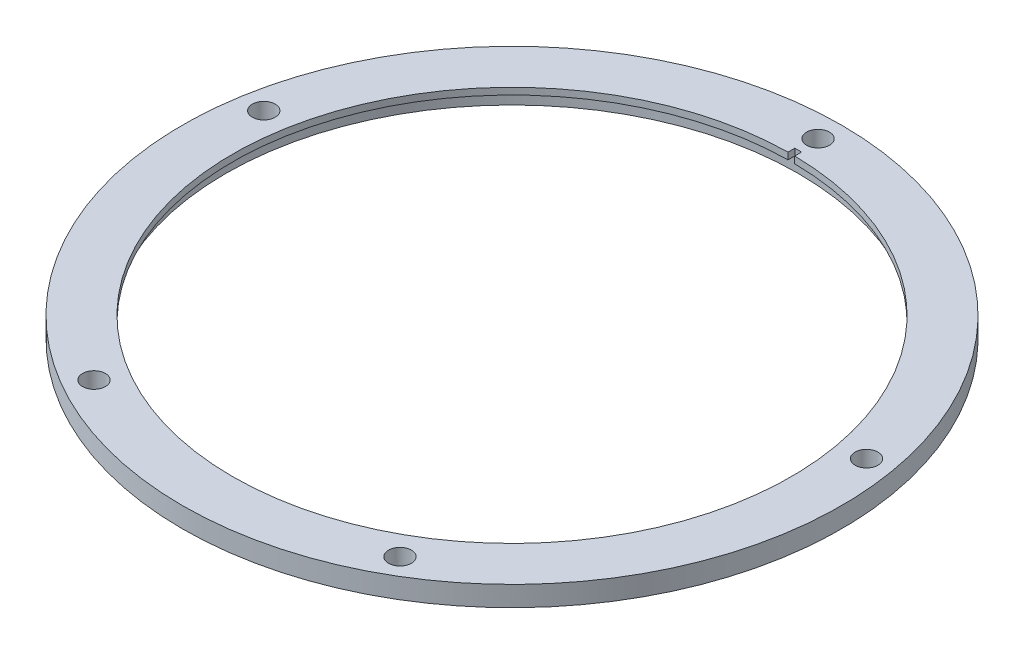
ISO-10303-21;
HEADER;
FILE_DESCRIPTION(('STEP AP214'),'2;1');
FILE_NAME('part.step','',(''),(''),'','','');
FILE_SCHEMA(('AUTOMOTIVE_DESIGN { 1 0 10303 214 1 1 1 1 }'));
ENDSEC;
DATA;
#1=APPLICATION_CONTEXT('core data for automotive mechanical design processes');
#2=APPLICATION_PROTOCOL_DEFINITION('international standard','automotive_design',2000,#1);
#3=PRODUCT_CONTEXT('',#1,'mechanical');
#4=PRODUCT('Part','Part','',(#3));
#5=PRODUCT_RELATED_PRODUCT_CATEGORY('part','',(#4));
#6=PRODUCT_DEFINITION_FORMATION('','',#4);
#7=PRODUCT_DEFINITION_CONTEXT('part definition',#1,'design');
#8=PRODUCT_DEFINITION('design','',#6,#7);
#9=PRODUCT_DEFINITION_SHAPE('','',#8);
#10=(LENGTH_UNIT() NAMED_UNIT(*) SI_UNIT(.MILLI.,.METRE.));
#11=(NAMED_UNIT(*) PLANE_ANGLE_UNIT() SI_UNIT($,.RADIAN.));
#12=(NAMED_UNIT(*) SI_UNIT($,.STERADIAN.) SOLID_ANGLE_UNIT());
#13=UNCERTAINTY_MEASURE_WITH_UNIT(LENGTH_MEASURE(1.E-05),#10,'distance_accuracy_value','');
#14=(GEOMETRIC_REPRESENTATION_CONTEXT(3) GLOBAL_UNCERTAINTY_ASSIGNED_CONTEXT((#13)) GLOBAL_UNIT_ASSIGNED_CONTEXT((#10,
#11,#12)) REPRESENTATION_CONTEXT('',''));
#15=CARTESIAN_POINT('',(0.,0.,0.));
#16=DIRECTION('',(0.,0.,1.));
#17=DIRECTION('',(1.,0.,0.));
#18=AXIS2_PLACEMENT_3D('',#15,#16,#17);
#19=CARTESIAN_POINT('',(-17.2342801043306,1.,2.98864894795127));
#20=DIRECTION('',(0.,1.,0.));
#21=DIRECTION('',(0.,0.,1.));
#22=AXIS2_PLACEMENT_3D('',#19,#20,#21);
#23=PLANE('',#22);
#24=CARTESIAN_POINT('',(27.5744726577248,1.,-4.91234313589386));
#25=DIRECTION('',(0.,1.,0.));
#26=DIRECTION('',(0.,0.,1.));
#27=AXIS2_PLACEMENT_3D('',#24,#25,#26);
#28=CIRCLE('',#27,1.7);
#29=CARTESIAN_POINT('',(27.5744726577248,1.,-3.21234313589386));
#30=VERTEX_POINT('',#29);
#31=EDGE_CURVE('E149',#30,#30,#28,.T.);
#32=ORIENTED_EDGE('',*,*,#31,.F.);
#33=EDGE_LOOP('',(#32));
#34=FACE_BOUND('',#33,.T.);
#35=CARTESIAN_POINT('',(5.5157198956695,1.,42.392804820143));
#36=DIRECTION('',(0.,1.,0.));
#37=DIRECTION('',(0.,0.,1.));
#38=AXIS2_PLACEMENT_3D('',#35,#36,#37);
#39=CIRCLE('',#38,1.7);
#40=CARTESIAN_POINT('',(5.5157198956695,1.,44.092804820143));
#41=VERTEX_POINT('',#40);
#42=EDGE_CURVE('E153',#41,#41,#39,.T.);
#43=ORIENTED_EDGE('',*,*,#42,.F.);
#44=EDGE_LOOP('',(#43));
#45=FACE_BOUND('',#44,.T.);
#46=CARTESIAN_POINT('',(-39.9842801043309,1.,42.392804820143));
#47=DIRECTION('',(0.,1.,0.));
#48=DIRECTION('',(0.,0.,1.));
#49=AXIS2_PLACEMENT_3D('',#46,#47,#48);
#50=CIRCLE('',#49,1.7);
#51=CARTESIAN_POINT('',(-39.9842801043309,1.,44.092804820143));
#52=VERTEX_POINT('',#51);
#53=EDGE_CURVE('E157',#52,#52,#50,.T.);
#54=ORIENTED_EDGE('',*,*,#53,.F.);
#55=EDGE_LOOP('',(#54));
#56=FACE_BOUND('',#55,.T.);
#57=CARTESIAN_POINT('',(-62.0430328663862,1.,-4.91234313589386));
#58=DIRECTION('',(0.,1.,0.));
#59=DIRECTION('',(0.,0.,1.));
#60=AXIS2_PLACEMENT_3D('',#57,#58,#59);
#61=CIRCLE('',#60,1.7);
#62=CARTESIAN_POINT('',(-62.0430328663862,1.,-3.21234313589386));
#63=VERTEX_POINT('',#62);
#64=EDGE_CURVE('E161',#63,#63,#61,.T.);
#65=ORIENTED_EDGE('',*,*,#64,.F.);
#66=EDGE_LOOP('',(#65));
#67=FACE_BOUND('',#66,.T.);
#68=CARTESIAN_POINT('',(-17.2342801043307,1.,-42.5113510520488));
#69=DIRECTION('',(0.,1.,0.));
#70=DIRECTION('',(0.,0.,1.));
#71=AXIS2_PLACEMENT_3D('',#68,#69,#70);
#72=CIRCLE('',#71,1.7);
#73=CARTESIAN_POINT('',(-17.2342801043307,1.,-40.8113510520488));
#74=VERTEX_POINT('',#73);
#75=EDGE_CURVE('E84',#74,#74,#72,.T.);
#76=ORIENTED_EDGE('',*,*,#75,.F.);
#77=EDGE_LOOP('',(#76));
#78=FACE_BOUND('',#77,.T.);
#79=CARTESIAN_POINT('',(-17.2342801043306,0.999999999999999,2.98864894795127));
#80=DIRECTION('',(0.,1.,0.));
#81=DIRECTION('',(0.,0.,1.));
#82=AXIS2_PLACEMENT_3D('',#79,#80,#81);
#83=CIRCLE('',#82,42.55);
#84=CARTESIAN_POINT('',(-16.7342801043305,0.999999999999999,-39.5584132303002));
#85=VERTEX_POINT('',#84);
#86=CARTESIAN_POINT('',(-17.7342801043305,0.999999999999999,-39.5584132303002));
#87=VERTEX_POINT('',#86);
#88=EDGE_CURVE('E95',#85,#87,#83,.T.);
#89=ORIENTED_EDGE('',*,*,#88,.F.);
#90=DIRECTION('',(0.,0.,-1.));
#91=VECTOR('',#90,1.);
#92=CARTESIAN_POINT('',(-16.7342801043305,1.,-38.5463416503382));
#93=LINE('',#92,#91);
#94=CARTESIAN_POINT('',(-16.7342801043305,1.,-38.5463416503382));
#95=VERTEX_POINT('',#94);
#96=EDGE_CURVE('E115',#95,#85,#93,.T.);
#97=ORIENTED_EDGE('',*,*,#96,.F.);
#98=CARTESIAN_POINT('',(-17.2342801043306,1.,2.98864894795127));
#99=DIRECTION('',(0.,1.,0.));
#100=DIRECTION('',(0.,0.,1.));
#101=AXIS2_PLACEMENT_3D('',#98,#99,#100);
#102=CIRCLE('',#101,41.538);
#103=CARTESIAN_POINT('',(-17.7342801043305,1.,-38.5463416503382));
#104=VERTEX_POINT('',#103);
#105=EDGE_CURVE('E118',#104,#95,#102,.T.);
#106=ORIENTED_EDGE('',*,*,#105,.F.);
#107=DIRECTION('',(0.,0.,1.));
#108=VECTOR('',#107,1.);
#109=CARTESIAN_POINT('',(-17.7342801043305,1.,-38.5463416503382));
#110=LINE('',#109,#108);
#111=EDGE_CURVE('E109',#87,#104,#110,.T.);
#112=ORIENTED_EDGE('',*,*,#111,.F.);
#113=EDGE_LOOP('',(#89,#97,#106,#112));
#114=FACE_BOUND('',#113,.T.);
#115=CARTESIAN_POINT('',(-17.2342801043306,1.,2.98864894795127));
#116=DIRECTION('',(0.,1.,0.));
#117=DIRECTION('',(0.,0.,1.));
#118=AXIS2_PLACEMENT_3D('',#115,#116,#117);
#119=CIRCLE('',#118,49.);
#120=CARTESIAN_POINT('',(-17.2342801043306,1.,51.9886489479513));
#121=VERTEX_POINT('',#120);
#122=EDGE_CURVE('E121',#121,#121,#119,.T.);
#123=ORIENTED_EDGE('',*,*,#122,.T.);
#124=EDGE_LOOP('',(#123));
#125=FACE_BOUND('',#124,.T.);
#126=ADVANCED_FACE('F34',(#34,#45,#56,#67,#78,#114,#125),#23,.T.);
#127=CARTESIAN_POINT('',(-17.2342801043306,0.,2.98864894795127));
#128=DIRECTION('',(0.,1.,0.));
#129=DIRECTION('',(0.,0.,1.));
#130=AXIS2_PLACEMENT_3D('',#127,#128,#129);
#131=PLANE('',#130);
#132=DIRECTION('',(0.,0.,-1.));
#133=VECTOR('',#132,1.);
#134=CARTESIAN_POINT('',(-16.7342801043305,0.,2.98864894795127));
#135=LINE('',#134,#133);
#136=CARTESIAN_POINT('',(-16.7342801043305,0.,-38.5463416503383));
#137=VERTEX_POINT('',#136);
#138=CARTESIAN_POINT('',(-16.7342801043305,0.,-39.5584132303002));
#139=VERTEX_POINT('',#138);
#140=EDGE_CURVE('E51',#137,#139,#135,.T.);
#141=ORIENTED_EDGE('',*,*,#140,.T.);
#142=CARTESIAN_POINT('',(-17.2342801043306,0.,2.98864894795127));
#143=DIRECTION('',(0.,-1.,0.));
#144=DIRECTION('',(0.,0.,-1.));
#145=AXIS2_PLACEMENT_3D('',#142,#143,#144);
#146=CIRCLE('',#145,42.55);
#147=CARTESIAN_POINT('',(-17.7342801043305,0.,-39.5584132303002));
#148=VERTEX_POINT('',#147);
#149=EDGE_CURVE('E75',#139,#148,#146,.T.);
#150=ORIENTED_EDGE('',*,*,#149,.T.);
#151=DIRECTION('',(0.,0.,1.));
#152=VECTOR('',#151,1.);
#153=CARTESIAN_POINT('',(-17.7342801043305,0.,2.98864894795127));
#154=LINE('',#153,#152);
#155=CARTESIAN_POINT('',(-17.7342801043305,0.,-38.5463416503382));
#156=VERTEX_POINT('',#155);
#157=EDGE_CURVE('E78',#148,#156,#154,.T.);
#158=ORIENTED_EDGE('',*,*,#157,.T.);
#159=CARTESIAN_POINT('',(-17.2342801043306,0.,2.98864894795127));
#160=DIRECTION('',(0.,1.,0.));
#161=DIRECTION('',(0.,0.,1.));
#162=AXIS2_PLACEMENT_3D('',#159,#160,#161);
#163=CIRCLE('',#162,41.538);
#164=EDGE_CURVE('E89',#156,#137,#163,.T.);
#165=ORIENTED_EDGE('',*,*,#164,.T.);
#166=EDGE_LOOP('',(#141,#150,#158,#165));
#167=FACE_BOUND('',#166,.T.);
#168=ADVANCED_FACE('F76',(#167),#131,.F.);
#169=CARTESIAN_POINT('',(-17.2342801043306,1.,2.98864894795127));
#170=DIRECTION('',(0.,-1.,0.));
#171=DIRECTION('',(0.,0.,-1.));
#172=AXIS2_PLACEMENT_3D('',#169,#170,#171);
#173=CYLINDRICAL_SURFACE('',#172,49.);
#174=ORIENTED_EDGE('',*,*,#122,.F.);
#175=EDGE_LOOP('',(#174));
#176=FACE_BOUND('',#175,.T.);
#177=CARTESIAN_POINT('',(-17.2342801043306,-2.,2.98864894795127));
#178=DIRECTION('',(0.,-1.,0.));
#179=DIRECTION('',(0.,0.,-1.));
#180=AXIS2_PLACEMENT_3D('',#177,#178,#179);
#181=CIRCLE('',#180,49.);
#182=CARTESIAN_POINT('',(-17.2342801043306,-2.,-46.0113510520487));
#183=VERTEX_POINT('',#182);
#184=EDGE_CURVE('E97',#183,#183,#181,.T.);
#185=ORIENTED_EDGE('',*,*,#184,.F.);
#186=EDGE_LOOP('',(#185));
#187=FACE_BOUND('',#186,.T.);
#188=ADVANCED_FACE('F36',(#176,#187),#173,.T.);
#189=CARTESIAN_POINT('',(-17.2342801043306,1.,2.98864894795127));
#190=DIRECTION('',(0.,-1.,0.));
#191=DIRECTION('',(0.,0.,-1.));
#192=AXIS2_PLACEMENT_3D('',#189,#190,#191);
#193=CYLINDRICAL_SURFACE('',#192,41.538);
#194=DIRECTION('',(0.,-1.,0.));
#195=VECTOR('',#194,1.);
#196=CARTESIAN_POINT('',(-17.7342801043305,1.,-38.5463416503383));
#197=LINE('',#196,#195);
#198=EDGE_CURVE('E11',#104,#156,#197,.T.);
#199=ORIENTED_EDGE('',*,*,#198,.F.);
#200=ORIENTED_EDGE('',*,*,#105,.T.);
#201=DIRECTION('',(0.,-1.,0.));
#202=VECTOR('',#201,1.);
#203=CARTESIAN_POINT('',(-16.7342801043305,1.,-38.5463416503383));
#204=LINE('',#203,#202);
#205=EDGE_CURVE('E43',#137,#95,#204,.F.);
#206=ORIENTED_EDGE('',*,*,#205,.F.);
#207=ORIENTED_EDGE('',*,*,#164,.F.);
#208=EDGE_LOOP('',(#199,#200,#206,#207));
#209=FACE_BOUND('',#208,.T.);
#210=ADVANCED_FACE('F130',(#209),#193,.F.);
#211=CARTESIAN_POINT('',(-17.7342801043305,-9.,-38.5463416503382));
#212=DIRECTION('',(-1.,0.,0.));
#213=DIRECTION('',(0.,0.,1.));
#214=AXIS2_PLACEMENT_3D('',#211,#212,#213);
#215=PLANE('',#214);
#216=ORIENTED_EDGE('',*,*,#157,.F.);
#217=DIRECTION('',(0.,-1.,0.));
#218=VECTOR('',#217,1.);
#219=CARTESIAN_POINT('',(-17.7342801043305,10.,-39.5584132303002));
#220=LINE('',#219,#218);
#221=EDGE_CURVE('E88',#87,#148,#220,.T.);
#222=ORIENTED_EDGE('',*,*,#221,.F.);
#223=ORIENTED_EDGE('',*,*,#111,.T.);
#224=ORIENTED_EDGE('',*,*,#198,.T.);
#225=EDGE_LOOP('',(#216,#222,#223,#224));
#226=FACE_BOUND('',#225,.T.);
#227=ADVANCED_FACE('F87',(#226),#215,.F.);
#228=CARTESIAN_POINT('',(-16.7342801043305,-9.,-38.5463416503382));
#229=DIRECTION('',(1.,0.,0.));
#230=DIRECTION('',(0.,0.,-1.));
#231=AXIS2_PLACEMENT_3D('',#228,#229,#230);
#232=PLANE('',#231);
#233=ORIENTED_EDGE('',*,*,#205,.T.);
#234=ORIENTED_EDGE('',*,*,#96,.T.);
#235=DIRECTION('',(0.,-1.,0.));
#236=VECTOR('',#235,1.);
#237=CARTESIAN_POINT('',(-16.7342801043305,10.,-39.5584132303002));
#238=LINE('',#237,#236);
#239=EDGE_CURVE('E96',#85,#139,#238,.T.);
#240=ORIENTED_EDGE('',*,*,#239,.T.);
#241=ORIENTED_EDGE('',*,*,#140,.F.);
#242=EDGE_LOOP('',(#233,#234,#240,#241));
#243=FACE_BOUND('',#242,.T.);
#244=ADVANCED_FACE('F125',(#243),#232,.F.);
#245=CARTESIAN_POINT('',(-17.2342801043306,10.,2.98864894795127));
#246=DIRECTION('',(0.,-1.,0.));
#247=DIRECTION('',(0.,0.,-1.));
#248=AXIS2_PLACEMENT_3D('',#245,#246,#247);
#249=CYLINDRICAL_SURFACE('',#248,42.55);
#250=ORIENTED_EDGE('',*,*,#88,.T.);
#251=ORIENTED_EDGE('',*,*,#221,.T.);
#252=ORIENTED_EDGE('',*,*,#149,.F.);
#253=ORIENTED_EDGE('',*,*,#239,.F.);
#254=EDGE_LOOP('',(#250,#251,#252,#253));
#255=FACE_BOUND('',#254,.T.);
#256=CARTESIAN_POINT('',(-17.2342801043306,-2.,2.98864894795127));
#257=DIRECTION('',(0.,-1.,0.));
#258=DIRECTION('',(0.,0.,-1.));
#259=AXIS2_PLACEMENT_3D('',#256,#257,#258);
#260=CIRCLE('',#259,42.55);
#261=CARTESIAN_POINT('',(-17.2342801043306,-2.,-39.5613510520487));
#262=VERTEX_POINT('',#261);
#263=EDGE_CURVE('E83',#262,#262,#260,.T.);
#264=ORIENTED_EDGE('',*,*,#263,.T.);
#265=EDGE_LOOP('',(#264));
#266=FACE_BOUND('',#265,.T.);
#267=ADVANCED_FACE('F92',(#255,#266),#249,.F.);
#268=CARTESIAN_POINT('',(-17.2342801043306,-2.,2.98864894795127));
#269=DIRECTION('',(0.,-1.,0.));
#270=DIRECTION('',(0.,0.,-1.));
#271=AXIS2_PLACEMENT_3D('',#268,#269,#270);
#272=PLANE('',#271);
#273=CARTESIAN_POINT('',(27.5744726577248,-2.00000000000004,-4.91234313589386));
#274=DIRECTION('',(0.,1.,0.));
#275=DIRECTION('',(-1.,0.,0.));
#276=AXIS2_PLACEMENT_3D('',#273,#274,#275);
#277=CIRCLE('',#276,1.7);
#278=CARTESIAN_POINT('',(25.8744726577248,-2.00000000000004,-4.91234313589386));
#279=VERTEX_POINT('',#278);
#280=EDGE_CURVE('E258',#279,#279,#277,.T.);
#281=ORIENTED_EDGE('',*,*,#280,.T.);
#282=EDGE_LOOP('',(#281));
#283=FACE_BOUND('',#282,.T.);
#284=CARTESIAN_POINT('',(5.5157198956695,-2.00000000000005,42.392804820143));
#285=DIRECTION('',(0.,1.,0.));
#286=DIRECTION('',(-1.,0.,0.));
#287=AXIS2_PLACEMENT_3D('',#284,#285,#286);
#288=CIRCLE('',#287,1.7);
#289=CARTESIAN_POINT('',(3.8157198956695,-2.00000000000005,42.392804820143));
#290=VERTEX_POINT('',#289);
#291=EDGE_CURVE('E260',#290,#290,#288,.T.);
#292=ORIENTED_EDGE('',*,*,#291,.T.);
#293=EDGE_LOOP('',(#292));
#294=FACE_BOUND('',#293,.T.);
#295=CARTESIAN_POINT('',(-39.9842801043309,-2.00000000000003,42.392804820143));
#296=DIRECTION('',(0.,1.,0.));
#297=DIRECTION('',(-1.,0.,0.));
#298=AXIS2_PLACEMENT_3D('',#295,#296,#297);
#299=CIRCLE('',#298,1.7);
#300=CARTESIAN_POINT('',(-41.6842801043309,-2.00000000000003,42.392804820143));
#301=VERTEX_POINT('',#300);
#302=EDGE_CURVE('E266',#301,#301,#299,.T.);
#303=ORIENTED_EDGE('',*,*,#302,.T.);
#304=EDGE_LOOP('',(#303));
#305=FACE_BOUND('',#304,.T.);
#306=CARTESIAN_POINT('',(-62.0430328663862,-2.00000000000001,-4.91234313589386));
#307=DIRECTION('',(0.,1.,0.));
#308=DIRECTION('',(-1.,0.,0.));
#309=AXIS2_PLACEMENT_3D('',#306,#307,#308);
#310=CIRCLE('',#309,1.7);
#311=CARTESIAN_POINT('',(-63.7430328663862,-2.00000000000001,-4.91234313589386));
#312=VERTEX_POINT('',#311);
#313=EDGE_CURVE('E270',#312,#312,#310,.T.);
#314=ORIENTED_EDGE('',*,*,#313,.T.);
#315=EDGE_LOOP('',(#314));
#316=FACE_BOUND('',#315,.T.);
#317=CARTESIAN_POINT('',(-17.2342801043307,-2.00000000000002,-42.5113510520488));
#318=DIRECTION('',(0.,1.,0.));
#319=DIRECTION('',(-1.,0.,0.));
#320=AXIS2_PLACEMENT_3D('',#317,#318,#319);
#321=CIRCLE('',#320,1.7);
#322=CARTESIAN_POINT('',(-18.9342801043307,-2.00000000000002,-42.5113510520488));
#323=VERTEX_POINT('',#322);
#324=EDGE_CURVE('E165',#323,#323,#321,.T.);
#325=ORIENTED_EDGE('',*,*,#324,.T.);
#326=EDGE_LOOP('',(#325));
#327=FACE_BOUND('',#326,.T.);
#328=ORIENTED_EDGE('',*,*,#184,.T.);
#329=EDGE_LOOP('',(#328));
#330=FACE_BOUND('',#329,.T.);
#331=ORIENTED_EDGE('',*,*,#263,.F.);
#332=EDGE_LOOP('',(#331));
#333=FACE_BOUND('',#332,.T.);
#334=ADVANCED_FACE('F173',(#283,#294,#305,#316,#327,#330,#333),#272,.T.);
#335=CARTESIAN_POINT('',(-17.2342801043307,-2.00000000000002,-42.5113510520488));
#336=DIRECTION('',(0.,1.,0.));
#337=DIRECTION('',(-1.,0.,0.));
#338=AXIS2_PLACEMENT_3D('',#335,#336,#337);
#339=CYLINDRICAL_SURFACE('',#338,1.7);
#340=ORIENTED_EDGE('',*,*,#75,.T.);
#341=EDGE_LOOP('',(#340));
#342=FACE_BOUND('',#341,.T.);
#343=ORIENTED_EDGE('',*,*,#324,.F.);
#344=EDGE_LOOP('',(#343));
#345=FACE_BOUND('',#344,.T.);
#346=ADVANCED_FACE('F175',(#342,#345),#339,.F.);
#347=CARTESIAN_POINT('',(-62.0430328663862,-2.00000000000001,-4.91234313589386));
#348=DIRECTION('',(0.,1.,0.));
#349=DIRECTION('',(-1.,0.,0.));
#350=AXIS2_PLACEMENT_3D('',#347,#348,#349);
#351=CYLINDRICAL_SURFACE('',#350,1.7);
#352=ORIENTED_EDGE('',*,*,#64,.T.);
#353=EDGE_LOOP('',(#352));
#354=FACE_BOUND('',#353,.T.);
#355=ORIENTED_EDGE('',*,*,#313,.F.);
#356=EDGE_LOOP('',(#355));
#357=FACE_BOUND('',#356,.T.);
#358=ADVANCED_FACE('F182',(#354,#357),#351,.F.);
#359=CARTESIAN_POINT('',(-39.9842801043309,-2.00000000000003,42.392804820143));
#360=DIRECTION('',(0.,1.,0.));
#361=DIRECTION('',(-1.,0.,0.));
#362=AXIS2_PLACEMENT_3D('',#359,#360,#361);
#363=CYLINDRICAL_SURFACE('',#362,1.7);
#364=ORIENTED_EDGE('',*,*,#53,.T.);
#365=EDGE_LOOP('',(#364));
#366=FACE_BOUND('',#365,.T.);
#367=ORIENTED_EDGE('',*,*,#302,.F.);
#368=EDGE_LOOP('',(#367));
#369=FACE_BOUND('',#368,.T.);
#370=ADVANCED_FACE('F223',(#366,#369),#363,.F.);
#371=CARTESIAN_POINT('',(5.5157198956695,-2.00000000000005,42.392804820143));
#372=DIRECTION('',(0.,1.,0.));
#373=DIRECTION('',(-1.,0.,0.));
#374=AXIS2_PLACEMENT_3D('',#371,#372,#373);
#375=CYLINDRICAL_SURFACE('',#374,1.7);
#376=ORIENTED_EDGE('',*,*,#42,.T.);
#377=EDGE_LOOP('',(#376));
#378=FACE_BOUND('',#377,.T.);
#379=ORIENTED_EDGE('',*,*,#291,.F.);
#380=EDGE_LOOP('',(#379));
#381=FACE_BOUND('',#380,.T.);
#382=ADVANCED_FACE('F232',(#378,#381),#375,.F.);
#383=CARTESIAN_POINT('',(27.5744726577248,-2.00000000000004,-4.91234313589386));
#384=DIRECTION('',(0.,1.,0.));
#385=DIRECTION('',(-1.,0.,0.));
#386=AXIS2_PLACEMENT_3D('',#383,#384,#385);
#387=CYLINDRICAL_SURFACE('',#386,1.7);
#388=ORIENTED_EDGE('',*,*,#31,.T.);
#389=EDGE_LOOP('',(#388));
#390=FACE_BOUND('',#389,.T.);
#391=ORIENTED_EDGE('',*,*,#280,.F.);
#392=EDGE_LOOP('',(#391));
#393=FACE_BOUND('',#392,.T.);
#394=ADVANCED_FACE('F242',(#390,#393),#387,.F.);
#395=CLOSED_SHELL('',(#126,#168,#188,#210,#227,#244,#267,#334,#346,#358,#370,#382,#394));
#396=MANIFOLD_SOLID_BREP('B2',#395);
#397=ADVANCED_BREP_SHAPE_REPRESENTATION('',(#18,#396),#14);
#398=SHAPE_DEFINITION_REPRESENTATION(#9,#397);
ENDSEC;
END-ISO-10303-21;
